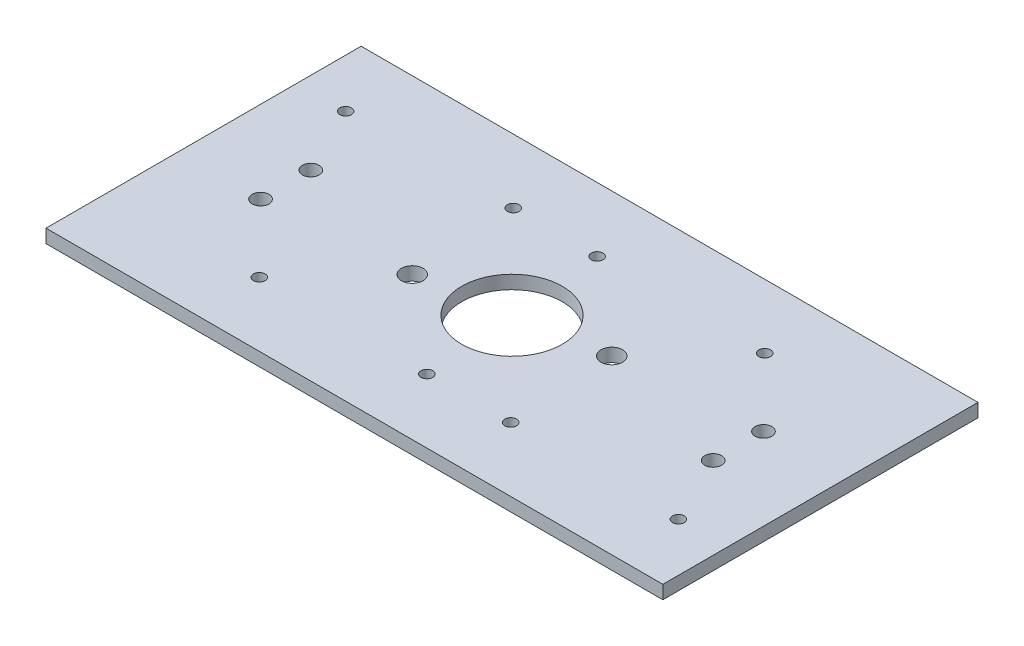
ISO-10303-21;
HEADER;
FILE_DESCRIPTION(('STEP AP214'),'2;1');
FILE_NAME('part.step','',(''),(''),'','','');
FILE_SCHEMA(('AUTOMOTIVE_DESIGN { 1 0 10303 214 1 1 1 1 }'));
ENDSEC;
DATA;
#1=APPLICATION_CONTEXT('core data for automotive mechanical design processes');
#2=APPLICATION_PROTOCOL_DEFINITION('international standard','automotive_design',2000,#1);
#3=PRODUCT_CONTEXT('',#1,'mechanical');
#4=PRODUCT('Part','Part','',(#3));
#5=PRODUCT_RELATED_PRODUCT_CATEGORY('part','',(#4));
#6=PRODUCT_DEFINITION_FORMATION('','',#4);
#7=PRODUCT_DEFINITION_CONTEXT('part definition',#1,'design');
#8=PRODUCT_DEFINITION('design','',#6,#7);
#9=PRODUCT_DEFINITION_SHAPE('','',#8);
#10=(LENGTH_UNIT() NAMED_UNIT(*) SI_UNIT(.MILLI.,.METRE.));
#11=(NAMED_UNIT(*) PLANE_ANGLE_UNIT() SI_UNIT($,.RADIAN.));
#12=(NAMED_UNIT(*) SI_UNIT($,.STERADIAN.) SOLID_ANGLE_UNIT());
#13=UNCERTAINTY_MEASURE_WITH_UNIT(LENGTH_MEASURE(1.E-05),#10,'distance_accuracy_value','');
#14=(GEOMETRIC_REPRESENTATION_CONTEXT(3) GLOBAL_UNCERTAINTY_ASSIGNED_CONTEXT((#13)) GLOBAL_UNIT_ASSIGNED_CONTEXT((#10,
#11,#12)) REPRESENTATION_CONTEXT('',''));
#15=CARTESIAN_POINT('',(0.,0.,0.));
#16=DIRECTION('',(0.,0.,1.));
#17=DIRECTION('',(1.,0.,0.));
#18=AXIS2_PLACEMENT_3D('',#15,#16,#17);
#19=CARTESIAN_POINT('',(0.,4.,0.));
#20=DIRECTION('',(0.,-1.,0.));
#21=DIRECTION('',(0.,0.,-1.));
#22=AXIS2_PLACEMENT_3D('',#19,#20,#21);
#23=PLANE('',#22);
#24=DIRECTION('',(0.,0.,-1.));
#25=VECTOR('',#24,1.);
#26=CARTESIAN_POINT('',(92.,4.,47.));
#27=LINE('',#26,#25);
#28=CARTESIAN_POINT('',(92.,4.,47.));
#29=VERTEX_POINT('',#28);
#30=CARTESIAN_POINT('',(92.,4.,-47.));
#31=VERTEX_POINT('',#30);
#32=EDGE_CURVE('E98',#29,#31,#27,.T.);
#33=ORIENTED_EDGE('',*,*,#32,.T.);
#34=DIRECTION('',(-1.,0.,0.));
#35=VECTOR('',#34,1.);
#36=CARTESIAN_POINT('',(-92.,4.,-47.));
#37=LINE('',#36,#35);
#38=CARTESIAN_POINT('',(-92.,4.,-47.));
#39=VERTEX_POINT('',#38);
#40=EDGE_CURVE('E93',#31,#39,#37,.T.);
#41=ORIENTED_EDGE('',*,*,#40,.T.);
#42=DIRECTION('',(0.,0.,1.));
#43=VECTOR('',#42,1.);
#44=CARTESIAN_POINT('',(-92.,4.,47.));
#45=LINE('',#44,#43);
#46=CARTESIAN_POINT('',(-92.,4.,47.));
#47=VERTEX_POINT('',#46);
#48=EDGE_CURVE('E96',#39,#47,#45,.T.);
#49=ORIENTED_EDGE('',*,*,#48,.T.);
#50=DIRECTION('',(1.,0.,0.));
#51=VECTOR('',#50,1.);
#52=CARTESIAN_POINT('',(-92.,4.,47.));
#53=LINE('',#52,#51);
#54=EDGE_CURVE('E63',#47,#29,#53,.T.);
#55=ORIENTED_EDGE('',*,*,#54,.T.);
#56=EDGE_LOOP('',(#33,#41,#49,#55));
#57=FACE_BOUND('',#56,.T.);
#58=CARTESIAN_POINT('',(0.,4.,0.));
#59=DIRECTION('',(0.,1.,0.));
#60=DIRECTION('',(0.,0.,1.));
#61=AXIS2_PLACEMENT_3D('',#58,#59,#60);
#62=CIRCLE('',#61,15.);
#63=CARTESIAN_POINT('',(0.,4.,15.));
#64=VERTEX_POINT('',#63);
#65=EDGE_CURVE('E118',#64,#64,#62,.T.);
#66=ORIENTED_EDGE('',*,*,#65,.F.);
#67=EDGE_LOOP('',(#66));
#68=FACE_BOUND('',#67,.T.);
#69=CARTESIAN_POINT('',(-2.50000000000001,4.,-27.88));
#70=DIRECTION('',(0.,1.,0.));
#71=DIRECTION('',(0.,0.,1.));
#72=AXIS2_PLACEMENT_3D('',#69,#70,#71);
#73=CIRCLE('',#72,1.75);
#74=CARTESIAN_POINT('',(-2.50000000000001,4.,-26.13));
#75=VERTEX_POINT('',#74);
#76=EDGE_CURVE('E140',#75,#75,#73,.T.);
#77=ORIENTED_EDGE('',*,*,#76,.F.);
#78=EDGE_LOOP('',(#77));
#79=FACE_BOUND('',#78,.T.);
#80=CARTESIAN_POINT('',(-27.5,4.,-27.88));
#81=DIRECTION('',(0.,1.,0.));
#82=DIRECTION('',(0.,0.,1.));
#83=AXIS2_PLACEMENT_3D('',#80,#81,#82);
#84=CIRCLE('',#83,1.75);
#85=CARTESIAN_POINT('',(-27.5,4.,-26.13));
#86=VERTEX_POINT('',#85);
#87=EDGE_CURVE('E148',#86,#86,#84,.T.);
#88=ORIENTED_EDGE('',*,*,#87,.F.);
#89=EDGE_LOOP('',(#88));
#90=FACE_BOUND('',#89,.T.);
#91=CARTESIAN_POINT('',(47.5,4.,-27.88));
#92=DIRECTION('',(0.,1.,0.));
#93=DIRECTION('',(0.,0.,1.));
#94=AXIS2_PLACEMENT_3D('',#91,#92,#93);
#95=CIRCLE('',#94,1.75);
#96=CARTESIAN_POINT('',(47.5,4.,-26.13));
#97=VERTEX_POINT('',#96);
#98=EDGE_CURVE('E156',#97,#97,#95,.T.);
#99=ORIENTED_EDGE('',*,*,#98,.F.);
#100=EDGE_LOOP('',(#99));
#101=FACE_BOUND('',#100,.T.);
#102=CARTESIAN_POINT('',(-77.5,4.,-27.88));
#103=DIRECTION('',(0.,1.,0.));
#104=DIRECTION('',(0.,0.,1.));
#105=AXIS2_PLACEMENT_3D('',#102,#103,#104);
#106=CIRCLE('',#105,1.75);
#107=CARTESIAN_POINT('',(-77.5,4.,-26.13));
#108=VERTEX_POINT('',#107);
#109=EDGE_CURVE('E164',#108,#108,#106,.T.);
#110=ORIENTED_EDGE('',*,*,#109,.F.);
#111=EDGE_LOOP('',(#110));
#112=FACE_BOUND('',#111,.T.);
#113=CARTESIAN_POINT('',(25.4,4.,-4.36));
#114=DIRECTION('',(0.,1.,0.));
#115=DIRECTION('',(0.,0.,1.));
#116=AXIS2_PLACEMENT_3D('',#113,#114,#115);
#117=CIRCLE('',#116,3.225);
#118=CARTESIAN_POINT('',(25.4,4.,-1.135));
#119=VERTEX_POINT('',#118);
#120=EDGE_CURVE('E172',#119,#119,#117,.T.);
#121=ORIENTED_EDGE('',*,*,#120,.F.);
#122=EDGE_LOOP('',(#121));
#123=FACE_BOUND('',#122,.T.);
#124=CARTESIAN_POINT('',(-67.5,4.,-7.5));
#125=DIRECTION('',(0.,1.,0.));
#126=DIRECTION('',(0.,0.,1.));
#127=AXIS2_PLACEMENT_3D('',#124,#125,#126);
#128=CIRCLE('',#127,2.5);
#129=CARTESIAN_POINT('',(-67.5,4.,-5.));
#130=VERTEX_POINT('',#129);
#131=EDGE_CURVE('E180',#130,#130,#128,.T.);
#132=ORIENTED_EDGE('',*,*,#131,.F.);
#133=EDGE_LOOP('',(#132));
#134=FACE_BOUND('',#133,.T.);
#135=CARTESIAN_POINT('',(67.5,4.,-7.5));
#136=DIRECTION('',(0.,1.,0.));
#137=DIRECTION('',(0.,0.,1.));
#138=AXIS2_PLACEMENT_3D('',#135,#136,#137);
#139=CIRCLE('',#138,2.49999999999999);
#140=CARTESIAN_POINT('',(67.5,4.,-5.00000000000001));
#141=VERTEX_POINT('',#140);
#142=EDGE_CURVE('E188',#141,#141,#139,.T.);
#143=ORIENTED_EDGE('',*,*,#142,.F.);
#144=EDGE_LOOP('',(#143));
#145=FACE_BOUND('',#144,.T.);
#146=CARTESIAN_POINT('',(2.49999999999854,4.,27.8800000000052));
#147=DIRECTION('',(0.,1.,0.));
#148=DIRECTION('',(0.,0.,1.));
#149=AXIS2_PLACEMENT_3D('',#146,#147,#148);
#150=CIRCLE('',#149,1.74999999999727);
#151=CARTESIAN_POINT('',(2.49999999999854,4.,29.6300000000025));
#152=VERTEX_POINT('',#151);
#153=EDGE_CURVE('E196',#152,#152,#150,.T.);
#154=ORIENTED_EDGE('',*,*,#153,.F.);
#155=EDGE_LOOP('',(#154));
#156=FACE_BOUND('',#155,.T.);
#157=CARTESIAN_POINT('',(27.4999999999985,4.,27.8800000000073));
#158=DIRECTION('',(0.,1.,0.));
#159=DIRECTION('',(0.,0.,1.));
#160=AXIS2_PLACEMENT_3D('',#157,#158,#159);
#161=CIRCLE('',#160,1.74999999999671);
#162=CARTESIAN_POINT('',(27.4999999999985,4.,29.630000000004));
#163=VERTEX_POINT('',#162);
#164=EDGE_CURVE('E204',#163,#163,#161,.T.);
#165=ORIENTED_EDGE('',*,*,#164,.F.);
#166=EDGE_LOOP('',(#165));
#167=FACE_BOUND('',#166,.T.);
#168=CARTESIAN_POINT('',(-47.5000000000002,4.,27.8799999999997));
#169=DIRECTION('',(0.,1.,0.));
#170=DIRECTION('',(0.,0.,1.));
#171=AXIS2_PLACEMENT_3D('',#168,#169,#170);
#172=CIRCLE('',#171,1.75000000000001);
#173=CARTESIAN_POINT('',(-47.5000000000002,4.,29.6299999999997));
#174=VERTEX_POINT('',#173);
#175=EDGE_CURVE('E212',#174,#174,#172,.T.);
#176=ORIENTED_EDGE('',*,*,#175,.F.);
#177=EDGE_LOOP('',(#176));
#178=FACE_BOUND('',#177,.T.);
#179=CARTESIAN_POINT('',(77.4999999999985,4.,27.8800000000114));
#180=DIRECTION('',(0.,1.,0.));
#181=DIRECTION('',(0.,0.,1.));
#182=AXIS2_PLACEMENT_3D('',#179,#180,#181);
#183=CIRCLE('',#182,1.74999999999561);
#184=CARTESIAN_POINT('',(77.4999999999985,4.,29.630000000007));
#185=VERTEX_POINT('',#184);
#186=EDGE_CURVE('E220',#185,#185,#183,.T.);
#187=ORIENTED_EDGE('',*,*,#186,.F.);
#188=EDGE_LOOP('',(#187));
#189=FACE_BOUND('',#188,.T.);
#190=CARTESIAN_POINT('',(-25.3999999999995,4.,4.36000000000294));
#191=DIRECTION('',(0.,1.,0.));
#192=DIRECTION('',(0.,0.,1.));
#193=AXIS2_PLACEMENT_3D('',#190,#191,#192);
#194=CIRCLE('',#193,3.225);
#195=CARTESIAN_POINT('',(-25.3999999999995,4.,7.58500000000293));
#196=VERTEX_POINT('',#195);
#197=EDGE_CURVE('E228',#196,#196,#194,.T.);
#198=ORIENTED_EDGE('',*,*,#197,.F.);
#199=EDGE_LOOP('',(#198));
#200=FACE_BOUND('',#199,.T.);
#201=CARTESIAN_POINT('',(67.5000000000002,4.,7.50000000001058));
#202=DIRECTION('',(0.,1.,0.));
#203=DIRECTION('',(0.,0.,1.));
#204=AXIS2_PLACEMENT_3D('',#201,#202,#203);
#205=CIRCLE('',#204,2.49999999999729);
#206=CARTESIAN_POINT('',(67.5000000000002,4.,10.0000000000079));
#207=VERTEX_POINT('',#206);
#208=EDGE_CURVE('E236',#207,#207,#205,.T.);
#209=ORIENTED_EDGE('',*,*,#208,.F.);
#210=EDGE_LOOP('',(#209));
#211=FACE_BOUND('',#210,.T.);
#212=CARTESIAN_POINT('',(-67.5000000000001,4.,7.49999999999953));
#213=DIRECTION('',(0.,1.,0.));
#214=DIRECTION('',(0.,0.,1.));
#215=AXIS2_PLACEMENT_3D('',#212,#213,#214);
#216=CIRCLE('',#215,2.49999999999999);
#217=CARTESIAN_POINT('',(-67.5000000000001,4.,9.99999999999952));
#218=VERTEX_POINT('',#217);
#219=EDGE_CURVE('E244',#218,#218,#216,.T.);
#220=ORIENTED_EDGE('',*,*,#219,.F.);
#221=EDGE_LOOP('',(#220));
#222=FACE_BOUND('',#221,.T.);
#223=ADVANCED_FACE('F45',(#57,#68,#79,#90,#101,#112,#123,#134,#145,#156,#167,#178,#189,#200,
#211,#222),#23,.F.);
#224=CARTESIAN_POINT('',(0.,0.,0.));
#225=DIRECTION('',(0.,-1.,0.));
#226=DIRECTION('',(0.,0.,-1.));
#227=AXIS2_PLACEMENT_3D('',#224,#225,#226);
#228=PLANE('',#227);
#229=CARTESIAN_POINT('',(67.5000000000002,0.,7.50000000001058));
#230=DIRECTION('',(0.,1.,0.));
#231=DIRECTION('',(0.,0.,1.));
#232=AXIS2_PLACEMENT_3D('',#229,#230,#231);
#233=CIRCLE('',#232,2.49999999999729);
#234=CARTESIAN_POINT('',(67.5000000000002,0.,10.0000000000079));
#235=VERTEX_POINT('',#234);
#236=EDGE_CURVE('E240',#235,#235,#233,.T.);
#237=ORIENTED_EDGE('',*,*,#236,.T.);
#238=EDGE_LOOP('',(#237));
#239=FACE_BOUND('',#238,.T.);
#240=CARTESIAN_POINT('',(77.4999999999985,0.,27.8800000000114));
#241=DIRECTION('',(0.,1.,0.));
#242=DIRECTION('',(0.,0.,1.));
#243=AXIS2_PLACEMENT_3D('',#240,#241,#242);
#244=CIRCLE('',#243,1.74999999999561);
#245=CARTESIAN_POINT('',(77.4999999999985,0.,29.630000000007));
#246=VERTEX_POINT('',#245);
#247=EDGE_CURVE('E224',#246,#246,#244,.T.);
#248=ORIENTED_EDGE('',*,*,#247,.T.);
#249=EDGE_LOOP('',(#248));
#250=FACE_BOUND('',#249,.T.);
#251=CARTESIAN_POINT('',(27.4999999999985,0.,27.8800000000073));
#252=DIRECTION('',(0.,1.,0.));
#253=DIRECTION('',(0.,0.,1.));
#254=AXIS2_PLACEMENT_3D('',#251,#252,#253);
#255=CIRCLE('',#254,1.74999999999671);
#256=CARTESIAN_POINT('',(27.4999999999985,0.,29.630000000004));
#257=VERTEX_POINT('',#256);
#258=EDGE_CURVE('E208',#257,#257,#255,.T.);
#259=ORIENTED_EDGE('',*,*,#258,.T.);
#260=EDGE_LOOP('',(#259));
#261=FACE_BOUND('',#260,.T.);
#262=CARTESIAN_POINT('',(67.5,0.,-7.5));
#263=DIRECTION('',(0.,1.,0.));
#264=DIRECTION('',(0.,0.,1.));
#265=AXIS2_PLACEMENT_3D('',#262,#263,#264);
#266=CIRCLE('',#265,2.49999999999999);
#267=CARTESIAN_POINT('',(67.5,0.,-5.00000000000001));
#268=VERTEX_POINT('',#267);
#269=EDGE_CURVE('E192',#268,#268,#266,.T.);
#270=ORIENTED_EDGE('',*,*,#269,.T.);
#271=EDGE_LOOP('',(#270));
#272=FACE_BOUND('',#271,.T.);
#273=CARTESIAN_POINT('',(25.4,0.,-4.36));
#274=DIRECTION('',(0.,1.,0.));
#275=DIRECTION('',(0.,0.,1.));
#276=AXIS2_PLACEMENT_3D('',#273,#274,#275);
#277=CIRCLE('',#276,3.225);
#278=CARTESIAN_POINT('',(25.4,0.,-1.135));
#279=VERTEX_POINT('',#278);
#280=EDGE_CURVE('E176',#279,#279,#277,.T.);
#281=ORIENTED_EDGE('',*,*,#280,.T.);
#282=EDGE_LOOP('',(#281));
#283=FACE_BOUND('',#282,.T.);
#284=CARTESIAN_POINT('',(47.5,0.,-27.88));
#285=DIRECTION('',(0.,1.,0.));
#286=DIRECTION('',(0.,0.,1.));
#287=AXIS2_PLACEMENT_3D('',#284,#285,#286);
#288=CIRCLE('',#287,1.75);
#289=CARTESIAN_POINT('',(47.5,0.,-26.13));
#290=VERTEX_POINT('',#289);
#291=EDGE_CURVE('E160',#290,#290,#288,.T.);
#292=ORIENTED_EDGE('',*,*,#291,.T.);
#293=EDGE_LOOP('',(#292));
#294=FACE_BOUND('',#293,.T.);
#295=CARTESIAN_POINT('',(-2.50000000000001,0.,-27.88));
#296=DIRECTION('',(0.,1.,0.));
#297=DIRECTION('',(0.,0.,1.));
#298=AXIS2_PLACEMENT_3D('',#295,#296,#297);
#299=CIRCLE('',#298,1.75);
#300=CARTESIAN_POINT('',(-2.50000000000001,0.,-26.13));
#301=VERTEX_POINT('',#300);
#302=EDGE_CURVE('E144',#301,#301,#299,.T.);
#303=ORIENTED_EDGE('',*,*,#302,.T.);
#304=EDGE_LOOP('',(#303));
#305=FACE_BOUND('',#304,.T.);
#306=DIRECTION('',(0.,0.,-1.));
#307=VECTOR('',#306,1.);
#308=CARTESIAN_POINT('',(92.,0.,47.));
#309=LINE('',#308,#307);
#310=CARTESIAN_POINT('',(92.,0.,47.));
#311=VERTEX_POINT('',#310);
#312=CARTESIAN_POINT('',(92.,0.,-47.));
#313=VERTEX_POINT('',#312);
#314=EDGE_CURVE('E114',#311,#313,#309,.T.);
#315=ORIENTED_EDGE('',*,*,#314,.F.);
#316=DIRECTION('',(1.,0.,0.));
#317=VECTOR('',#316,1.);
#318=CARTESIAN_POINT('',(-92.,0.,47.));
#319=LINE('',#318,#317);
#320=CARTESIAN_POINT('',(-92.,0.,47.));
#321=VERTEX_POINT('',#320);
#322=EDGE_CURVE('E86',#321,#311,#319,.T.);
#323=ORIENTED_EDGE('',*,*,#322,.F.);
#324=DIRECTION('',(0.,0.,1.));
#325=VECTOR('',#324,1.);
#326=CARTESIAN_POINT('',(-92.,0.,47.));
#327=LINE('',#326,#325);
#328=CARTESIAN_POINT('',(-92.,0.,-47.));
#329=VERTEX_POINT('',#328);
#330=EDGE_CURVE('E80',#329,#321,#327,.T.);
#331=ORIENTED_EDGE('',*,*,#330,.F.);
#332=DIRECTION('',(-1.,0.,0.));
#333=VECTOR('',#332,1.);
#334=CARTESIAN_POINT('',(-92.,0.,-47.));
#335=LINE('',#334,#333);
#336=EDGE_CURVE('E103',#313,#329,#335,.T.);
#337=ORIENTED_EDGE('',*,*,#336,.F.);
#338=EDGE_LOOP('',(#315,#323,#331,#337));
#339=FACE_BOUND('',#338,.T.);
#340=CARTESIAN_POINT('',(0.,0.,0.));
#341=DIRECTION('',(0.,1.,0.));
#342=DIRECTION('',(0.,0.,1.));
#343=AXIS2_PLACEMENT_3D('',#340,#341,#342);
#344=CIRCLE('',#343,15.);
#345=CARTESIAN_POINT('',(0.,0.,15.));
#346=VERTEX_POINT('',#345);
#347=EDGE_CURVE('E136',#346,#346,#344,.T.);
#348=ORIENTED_EDGE('',*,*,#347,.T.);
#349=EDGE_LOOP('',(#348));
#350=FACE_BOUND('',#349,.T.);
#351=CARTESIAN_POINT('',(-27.5,0.,-27.88));
#352=DIRECTION('',(0.,1.,0.));
#353=DIRECTION('',(0.,0.,1.));
#354=AXIS2_PLACEMENT_3D('',#351,#352,#353);
#355=CIRCLE('',#354,1.75);
#356=CARTESIAN_POINT('',(-27.5,0.,-26.13));
#357=VERTEX_POINT('',#356);
#358=EDGE_CURVE('E152',#357,#357,#355,.T.);
#359=ORIENTED_EDGE('',*,*,#358,.T.);
#360=EDGE_LOOP('',(#359));
#361=FACE_BOUND('',#360,.T.);
#362=CARTESIAN_POINT('',(-77.5,0.,-27.88));
#363=DIRECTION('',(0.,1.,0.));
#364=DIRECTION('',(0.,0.,1.));
#365=AXIS2_PLACEMENT_3D('',#362,#363,#364);
#366=CIRCLE('',#365,1.75);
#367=CARTESIAN_POINT('',(-77.5,0.,-26.13));
#368=VERTEX_POINT('',#367);
#369=EDGE_CURVE('E168',#368,#368,#366,.T.);
#370=ORIENTED_EDGE('',*,*,#369,.T.);
#371=EDGE_LOOP('',(#370));
#372=FACE_BOUND('',#371,.T.);
#373=CARTESIAN_POINT('',(-67.5,0.,-7.5));
#374=DIRECTION('',(0.,1.,0.));
#375=DIRECTION('',(0.,0.,1.));
#376=AXIS2_PLACEMENT_3D('',#373,#374,#375);
#377=CIRCLE('',#376,2.5);
#378=CARTESIAN_POINT('',(-67.5,0.,-5.));
#379=VERTEX_POINT('',#378);
#380=EDGE_CURVE('E184',#379,#379,#377,.T.);
#381=ORIENTED_EDGE('',*,*,#380,.T.);
#382=EDGE_LOOP('',(#381));
#383=FACE_BOUND('',#382,.T.);
#384=CARTESIAN_POINT('',(2.49999999999854,0.,27.8800000000052));
#385=DIRECTION('',(0.,1.,0.));
#386=DIRECTION('',(0.,0.,1.));
#387=AXIS2_PLACEMENT_3D('',#384,#385,#386);
#388=CIRCLE('',#387,1.74999999999727);
#389=CARTESIAN_POINT('',(2.49999999999854,0.,29.6300000000025));
#390=VERTEX_POINT('',#389);
#391=EDGE_CURVE('E200',#390,#390,#388,.T.);
#392=ORIENTED_EDGE('',*,*,#391,.T.);
#393=EDGE_LOOP('',(#392));
#394=FACE_BOUND('',#393,.T.);
#395=CARTESIAN_POINT('',(-47.5000000000002,0.,27.8799999999997));
#396=DIRECTION('',(0.,1.,0.));
#397=DIRECTION('',(0.,0.,1.));
#398=AXIS2_PLACEMENT_3D('',#395,#396,#397);
#399=CIRCLE('',#398,1.75000000000001);
#400=CARTESIAN_POINT('',(-47.5000000000002,0.,29.6299999999997));
#401=VERTEX_POINT('',#400);
#402=EDGE_CURVE('E216',#401,#401,#399,.T.);
#403=ORIENTED_EDGE('',*,*,#402,.T.);
#404=EDGE_LOOP('',(#403));
#405=FACE_BOUND('',#404,.T.);
#406=CARTESIAN_POINT('',(-25.3999999999995,0.,4.36000000000294));
#407=DIRECTION('',(0.,1.,0.));
#408=DIRECTION('',(0.,0.,1.));
#409=AXIS2_PLACEMENT_3D('',#406,#407,#408);
#410=CIRCLE('',#409,3.225);
#411=CARTESIAN_POINT('',(-25.3999999999995,0.,7.58500000000293));
#412=VERTEX_POINT('',#411);
#413=EDGE_CURVE('E232',#412,#412,#410,.T.);
#414=ORIENTED_EDGE('',*,*,#413,.T.);
#415=EDGE_LOOP('',(#414));
#416=FACE_BOUND('',#415,.T.);
#417=CARTESIAN_POINT('',(-67.5000000000001,0.,7.49999999999953));
#418=DIRECTION('',(0.,1.,0.));
#419=DIRECTION('',(0.,0.,1.));
#420=AXIS2_PLACEMENT_3D('',#417,#418,#419);
#421=CIRCLE('',#420,2.49999999999999);
#422=CARTESIAN_POINT('',(-67.5000000000001,0.,9.99999999999952));
#423=VERTEX_POINT('',#422);
#424=EDGE_CURVE('E248',#423,#423,#421,.T.);
#425=ORIENTED_EDGE('',*,*,#424,.T.);
#426=EDGE_LOOP('',(#425));
#427=FACE_BOUND('',#426,.T.);
#428=ADVANCED_FACE('F131',(#239,#250,#261,#272,#283,#294,#305,#339,#350,#361,#372,#383,#394,
#405,#416,#427),#228,.T.);
#429=CARTESIAN_POINT('',(92.,4.,47.));
#430=DIRECTION('',(-1.,0.,0.));
#431=DIRECTION('',(0.,0.,1.));
#432=AXIS2_PLACEMENT_3D('',#429,#430,#431);
#433=PLANE('',#432);
#434=ORIENTED_EDGE('',*,*,#314,.T.);
#435=DIRECTION('',(0.,-1.,0.));
#436=VECTOR('',#435,1.);
#437=CARTESIAN_POINT('',(92.,4.,-47.));
#438=LINE('',#437,#436);
#439=EDGE_CURVE('E11',#31,#313,#438,.T.);
#440=ORIENTED_EDGE('',*,*,#439,.F.);
#441=ORIENTED_EDGE('',*,*,#32,.F.);
#442=DIRECTION('',(0.,-1.,0.));
#443=VECTOR('',#442,1.);
#444=CARTESIAN_POINT('',(92.,4.,47.));
#445=LINE('',#444,#443);
#446=EDGE_CURVE('E110',#29,#311,#445,.T.);
#447=ORIENTED_EDGE('',*,*,#446,.T.);
#448=EDGE_LOOP('',(#434,#440,#441,#447));
#449=FACE_BOUND('',#448,.T.);
#450=ADVANCED_FACE('F47',(#449),#433,.F.);
#451=CARTESIAN_POINT('',(-92.,4.,-47.));
#452=DIRECTION('',(0.,0.,1.));
#453=DIRECTION('',(1.,0.,0.));
#454=AXIS2_PLACEMENT_3D('',#451,#452,#453);
#455=PLANE('',#454);
#456=ORIENTED_EDGE('',*,*,#336,.T.);
#457=DIRECTION('',(0.,-1.,0.));
#458=VECTOR('',#457,1.);
#459=CARTESIAN_POINT('',(-92.,4.,-47.));
#460=LINE('',#459,#458);
#461=EDGE_CURVE('E55',#39,#329,#460,.T.);
#462=ORIENTED_EDGE('',*,*,#461,.F.);
#463=ORIENTED_EDGE('',*,*,#40,.F.);
#464=ORIENTED_EDGE('',*,*,#439,.T.);
#465=EDGE_LOOP('',(#456,#462,#463,#464));
#466=FACE_BOUND('',#465,.T.);
#467=ADVANCED_FACE('F102',(#466),#455,.F.);
#468=CARTESIAN_POINT('',(-92.,4.,47.));
#469=DIRECTION('',(1.,0.,0.));
#470=DIRECTION('',(0.,0.,-1.));
#471=AXIS2_PLACEMENT_3D('',#468,#469,#470);
#472=PLANE('',#471);
#473=ORIENTED_EDGE('',*,*,#330,.T.);
#474=DIRECTION('',(0.,-1.,0.));
#475=VECTOR('',#474,1.);
#476=CARTESIAN_POINT('',(-92.,4.,47.));
#477=LINE('',#476,#475);
#478=EDGE_CURVE('E105',#47,#321,#477,.T.);
#479=ORIENTED_EDGE('',*,*,#478,.F.);
#480=ORIENTED_EDGE('',*,*,#48,.F.);
#481=ORIENTED_EDGE('',*,*,#461,.T.);
#482=EDGE_LOOP('',(#473,#479,#480,#481));
#483=FACE_BOUND('',#482,.T.);
#484=ADVANCED_FACE('F106',(#483),#472,.F.);
#485=CARTESIAN_POINT('',(-92.,4.,47.));
#486=DIRECTION('',(0.,0.,-1.));
#487=DIRECTION('',(-1.,0.,0.));
#488=AXIS2_PLACEMENT_3D('',#485,#486,#487);
#489=PLANE('',#488);
#490=ORIENTED_EDGE('',*,*,#322,.T.);
#491=ORIENTED_EDGE('',*,*,#446,.F.);
#492=ORIENTED_EDGE('',*,*,#54,.F.);
#493=ORIENTED_EDGE('',*,*,#478,.T.);
#494=EDGE_LOOP('',(#490,#491,#492,#493));
#495=FACE_BOUND('',#494,.T.);
#496=ADVANCED_FACE('F128',(#495),#489,.F.);
#497=CARTESIAN_POINT('',(0.,4.,0.));
#498=DIRECTION('',(0.,-1.,0.));
#499=DIRECTION('',(0.,0.,-1.));
#500=AXIS2_PLACEMENT_3D('',#497,#498,#499);
#501=CYLINDRICAL_SURFACE('',#500,15.);
#502=ORIENTED_EDGE('',*,*,#65,.T.);
#503=EDGE_LOOP('',(#502));
#504=FACE_BOUND('',#503,.T.);
#505=ORIENTED_EDGE('',*,*,#347,.F.);
#506=EDGE_LOOP('',(#505));
#507=FACE_BOUND('',#506,.T.);
#508=ADVANCED_FACE('F267',(#504,#507),#501,.F.);
#509=CARTESIAN_POINT('',(-2.50000000000001,4.,-27.88));
#510=DIRECTION('',(0.,-1.,0.));
#511=DIRECTION('',(0.,0.,-1.));
#512=AXIS2_PLACEMENT_3D('',#509,#510,#511);
#513=CYLINDRICAL_SURFACE('',#512,1.75);
#514=ORIENTED_EDGE('',*,*,#76,.T.);
#515=EDGE_LOOP('',(#514));
#516=FACE_BOUND('',#515,.T.);
#517=ORIENTED_EDGE('',*,*,#302,.F.);
#518=EDGE_LOOP('',(#517));
#519=FACE_BOUND('',#518,.T.);
#520=ADVANCED_FACE('F312',(#516,#519),#513,.F.);
#521=CARTESIAN_POINT('',(-27.5,4.,-27.88));
#522=DIRECTION('',(0.,-1.,0.));
#523=DIRECTION('',(0.,0.,-1.));
#524=AXIS2_PLACEMENT_3D('',#521,#522,#523);
#525=CYLINDRICAL_SURFACE('',#524,1.75);
#526=ORIENTED_EDGE('',*,*,#87,.T.);
#527=EDGE_LOOP('',(#526));
#528=FACE_BOUND('',#527,.T.);
#529=ORIENTED_EDGE('',*,*,#358,.F.);
#530=EDGE_LOOP('',(#529));
#531=FACE_BOUND('',#530,.T.);
#532=ADVANCED_FACE('F320',(#528,#531),#525,.F.);
#533=CARTESIAN_POINT('',(47.5,4.,-27.88));
#534=DIRECTION('',(0.,-1.,0.));
#535=DIRECTION('',(0.,0.,-1.));
#536=AXIS2_PLACEMENT_3D('',#533,#534,#535);
#537=CYLINDRICAL_SURFACE('',#536,1.75);
#538=ORIENTED_EDGE('',*,*,#98,.T.);
#539=EDGE_LOOP('',(#538));
#540=FACE_BOUND('',#539,.T.);
#541=ORIENTED_EDGE('',*,*,#291,.F.);
#542=EDGE_LOOP('',(#541));
#543=FACE_BOUND('',#542,.T.);
#544=ADVANCED_FACE('F328',(#540,#543),#537,.F.);
#545=CARTESIAN_POINT('',(-77.5,4.,-27.88));
#546=DIRECTION('',(0.,-1.,0.));
#547=DIRECTION('',(0.,0.,-1.));
#548=AXIS2_PLACEMENT_3D('',#545,#546,#547);
#549=CYLINDRICAL_SURFACE('',#548,1.75);
#550=ORIENTED_EDGE('',*,*,#109,.T.);
#551=EDGE_LOOP('',(#550));
#552=FACE_BOUND('',#551,.T.);
#553=ORIENTED_EDGE('',*,*,#369,.F.);
#554=EDGE_LOOP('',(#553));
#555=FACE_BOUND('',#554,.T.);
#556=ADVANCED_FACE('F337',(#552,#555),#549,.F.);
#557=CARTESIAN_POINT('',(25.4,4.,-4.36));
#558=DIRECTION('',(0.,-1.,0.));
#559=DIRECTION('',(0.,0.,-1.));
#560=AXIS2_PLACEMENT_3D('',#557,#558,#559);
#561=CYLINDRICAL_SURFACE('',#560,3.225);
#562=ORIENTED_EDGE('',*,*,#120,.T.);
#563=EDGE_LOOP('',(#562));
#564=FACE_BOUND('',#563,.T.);
#565=ORIENTED_EDGE('',*,*,#280,.F.);
#566=EDGE_LOOP('',(#565));
#567=FACE_BOUND('',#566,.T.);
#568=ADVANCED_FACE('F346',(#564,#567),#561,.F.);
#569=CARTESIAN_POINT('',(-67.5,4.,-7.5));
#570=DIRECTION('',(0.,-1.,0.));
#571=DIRECTION('',(0.,0.,-1.));
#572=AXIS2_PLACEMENT_3D('',#569,#570,#571);
#573=CYLINDRICAL_SURFACE('',#572,2.5);
#574=ORIENTED_EDGE('',*,*,#131,.T.);
#575=EDGE_LOOP('',(#574));
#576=FACE_BOUND('',#575,.T.);
#577=ORIENTED_EDGE('',*,*,#380,.F.);
#578=EDGE_LOOP('',(#577));
#579=FACE_BOUND('',#578,.T.);
#580=ADVANCED_FACE('F355',(#576,#579),#573,.F.);
#581=CARTESIAN_POINT('',(67.5,4.,-7.5));
#582=DIRECTION('',(0.,-1.,0.));
#583=DIRECTION('',(0.,0.,-1.));
#584=AXIS2_PLACEMENT_3D('',#581,#582,#583);
#585=CYLINDRICAL_SURFACE('',#584,2.49999999999999);
#586=ORIENTED_EDGE('',*,*,#142,.T.);
#587=EDGE_LOOP('',(#586));
#588=FACE_BOUND('',#587,.T.);
#589=ORIENTED_EDGE('',*,*,#269,.F.);
#590=EDGE_LOOP('',(#589));
#591=FACE_BOUND('',#590,.T.);
#592=ADVANCED_FACE('F364',(#588,#591),#585,.F.);
#593=CARTESIAN_POINT('',(2.49999999999854,4.,27.8800000000052));
#594=DIRECTION('',(0.,-1.,0.));
#595=DIRECTION('',(0.,0.,-1.));
#596=AXIS2_PLACEMENT_3D('',#593,#594,#595);
#597=CYLINDRICAL_SURFACE('',#596,1.74999999999727);
#598=ORIENTED_EDGE('',*,*,#153,.T.);
#599=EDGE_LOOP('',(#598));
#600=FACE_BOUND('',#599,.T.);
#601=ORIENTED_EDGE('',*,*,#391,.F.);
#602=EDGE_LOOP('',(#601));
#603=FACE_BOUND('',#602,.T.);
#604=ADVANCED_FACE('F373',(#600,#603),#597,.F.);
#605=CARTESIAN_POINT('',(27.4999999999985,4.,27.8800000000073));
#606=DIRECTION('',(0.,-1.,0.));
#607=DIRECTION('',(0.,0.,-1.));
#608=AXIS2_PLACEMENT_3D('',#605,#606,#607);
#609=CYLINDRICAL_SURFACE('',#608,1.74999999999671);
#610=ORIENTED_EDGE('',*,*,#164,.T.);
#611=EDGE_LOOP('',(#610));
#612=FACE_BOUND('',#611,.T.);
#613=ORIENTED_EDGE('',*,*,#258,.F.);
#614=EDGE_LOOP('',(#613));
#615=FACE_BOUND('',#614,.T.);
#616=ADVANCED_FACE('F382',(#612,#615),#609,.F.);
#617=CARTESIAN_POINT('',(-47.5000000000002,4.,27.8799999999997));
#618=DIRECTION('',(0.,-1.,0.));
#619=DIRECTION('',(0.,0.,-1.));
#620=AXIS2_PLACEMENT_3D('',#617,#618,#619);
#621=CYLINDRICAL_SURFACE('',#620,1.75000000000001);
#622=ORIENTED_EDGE('',*,*,#175,.T.);
#623=EDGE_LOOP('',(#622));
#624=FACE_BOUND('',#623,.T.);
#625=ORIENTED_EDGE('',*,*,#402,.F.);
#626=EDGE_LOOP('',(#625));
#627=FACE_BOUND('',#626,.T.);
#628=ADVANCED_FACE('F391',(#624,#627),#621,.F.);
#629=CARTESIAN_POINT('',(77.4999999999985,4.,27.8800000000114));
#630=DIRECTION('',(0.,-1.,0.));
#631=DIRECTION('',(0.,0.,-1.));
#632=AXIS2_PLACEMENT_3D('',#629,#630,#631);
#633=CYLINDRICAL_SURFACE('',#632,1.74999999999561);
#634=ORIENTED_EDGE('',*,*,#186,.T.);
#635=EDGE_LOOP('',(#634));
#636=FACE_BOUND('',#635,.T.);
#637=ORIENTED_EDGE('',*,*,#247,.F.);
#638=EDGE_LOOP('',(#637));
#639=FACE_BOUND('',#638,.T.);
#640=ADVANCED_FACE('F400',(#636,#639),#633,.F.);
#641=CARTESIAN_POINT('',(-25.3999999999995,4.,4.36000000000294));
#642=DIRECTION('',(0.,-1.,0.));
#643=DIRECTION('',(0.,0.,-1.));
#644=AXIS2_PLACEMENT_3D('',#641,#642,#643);
#645=CYLINDRICAL_SURFACE('',#644,3.225);
#646=ORIENTED_EDGE('',*,*,#197,.T.);
#647=EDGE_LOOP('',(#646));
#648=FACE_BOUND('',#647,.T.);
#649=ORIENTED_EDGE('',*,*,#413,.F.);
#650=EDGE_LOOP('',(#649));
#651=FACE_BOUND('',#650,.T.);
#652=ADVANCED_FACE('F409',(#648,#651),#645,.F.);
#653=CARTESIAN_POINT('',(67.5000000000002,4.,7.50000000001058));
#654=DIRECTION('',(0.,-1.,0.));
#655=DIRECTION('',(0.,0.,-1.));
#656=AXIS2_PLACEMENT_3D('',#653,#654,#655);
#657=CYLINDRICAL_SURFACE('',#656,2.49999999999729);
#658=ORIENTED_EDGE('',*,*,#208,.T.);
#659=EDGE_LOOP('',(#658));
#660=FACE_BOUND('',#659,.T.);
#661=ORIENTED_EDGE('',*,*,#236,.F.);
#662=EDGE_LOOP('',(#661));
#663=FACE_BOUND('',#662,.T.);
#664=ADVANCED_FACE('F418',(#660,#663),#657,.F.);
#665=CARTESIAN_POINT('',(-67.5000000000001,4.,7.49999999999953));
#666=DIRECTION('',(0.,-1.,0.));
#667=DIRECTION('',(0.,0.,-1.));
#668=AXIS2_PLACEMENT_3D('',#665,#666,#667);
#669=CYLINDRICAL_SURFACE('',#668,2.49999999999999);
#670=ORIENTED_EDGE('',*,*,#219,.T.);
#671=EDGE_LOOP('',(#670));
#672=FACE_BOUND('',#671,.T.);
#673=ORIENTED_EDGE('',*,*,#424,.F.);
#674=EDGE_LOOP('',(#673));
#675=FACE_BOUND('',#674,.T.);
#676=ADVANCED_FACE('F256',(#672,#675),#669,.F.);
#677=CLOSED_SHELL('',(#223,#428,#450,#467,#484,#496,#508,#520,#532,#544,#556,#568,#580,#592,
#604,#616,#628,#640,#652,#664,#676));
#678=MANIFOLD_SOLID_BREP('B2',#677);
#679=ADVANCED_BREP_SHAPE_REPRESENTATION('',(#18,#678),#14);
#680=SHAPE_DEFINITION_REPRESENTATION(#9,#679);
ENDSEC;
END-ISO-10303-21;
